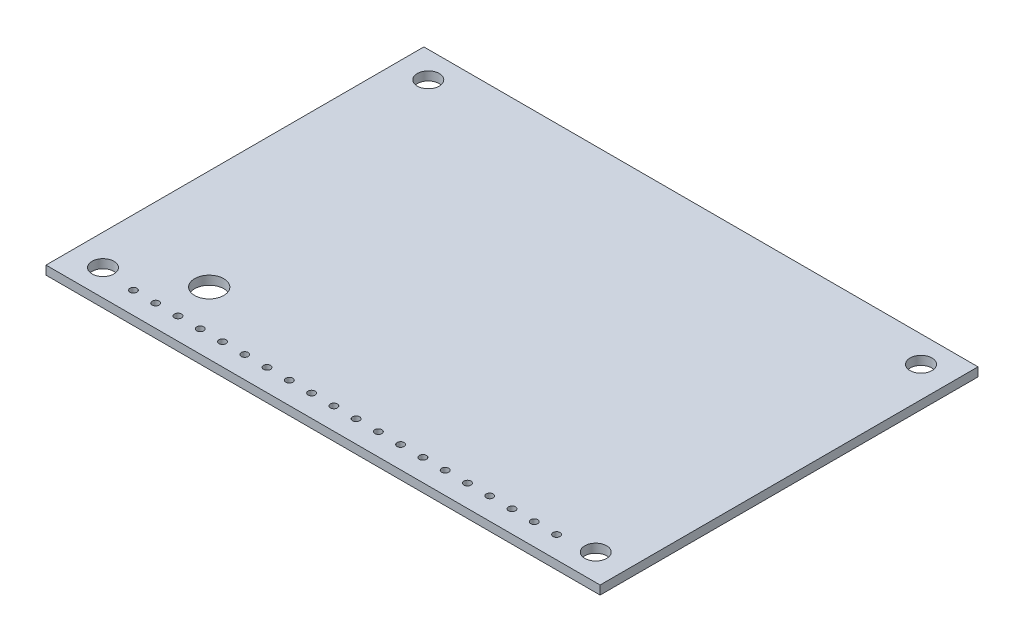
ISO-10303-21;
HEADER;
FILE_DESCRIPTION(('STEP AP214'),'2;1');
FILE_NAME('part.step','',(''),(''),'','','');
FILE_SCHEMA(('AUTOMOTIVE_DESIGN { 1 0 10303 214 1 1 1 1 }'));
ENDSEC;
DATA;
#1=APPLICATION_CONTEXT('core data for automotive mechanical design processes');
#2=APPLICATION_PROTOCOL_DEFINITION('international standard','automotive_design',2000,#1);
#3=PRODUCT_CONTEXT('',#1,'mechanical');
#4=PRODUCT('Part','Part','',(#3));
#5=PRODUCT_RELATED_PRODUCT_CATEGORY('part','',(#4));
#6=PRODUCT_DEFINITION_FORMATION('','',#4);
#7=PRODUCT_DEFINITION_CONTEXT('part definition',#1,'design');
#8=PRODUCT_DEFINITION('design','',#6,#7);
#9=PRODUCT_DEFINITION_SHAPE('','',#8);
#10=(LENGTH_UNIT() NAMED_UNIT(*) SI_UNIT(.MILLI.,.METRE.));
#11=(NAMED_UNIT(*) PLANE_ANGLE_UNIT() SI_UNIT($,.RADIAN.));
#12=(NAMED_UNIT(*) SI_UNIT($,.STERADIAN.) SOLID_ANGLE_UNIT());
#13=UNCERTAINTY_MEASURE_WITH_UNIT(LENGTH_MEASURE(1.E-05),#10,'distance_accuracy_value','');
#14=(GEOMETRIC_REPRESENTATION_CONTEXT(3) GLOBAL_UNCERTAINTY_ASSIGNED_CONTEXT((#13)) GLOBAL_UNIT_ASSIGNED_CONTEXT((#10,
#11,#12)) REPRESENTATION_CONTEXT('',''));
#15=CARTESIAN_POINT('',(0.,0.,0.));
#16=DIRECTION('',(0.,0.,1.));
#17=DIRECTION('',(1.,0.,0.));
#18=AXIS2_PLACEMENT_3D('',#15,#16,#17);
#19=CARTESIAN_POINT('',(0.,1.,0.));
#20=DIRECTION('',(1.,0.,0.));
#21=DIRECTION('',(0.,0.,-1.));
#22=AXIS2_PLACEMENT_3D('',#19,#20,#21);
#23=PLANE('',#22);
#24=DIRECTION('',(0.,0.,1.));
#25=VECTOR('',#24,1.);
#26=CARTESIAN_POINT('',(0.,0.,0.));
#27=LINE('',#26,#25);
#28=CARTESIAN_POINT('',(0.,0.,-43.1));
#29=VERTEX_POINT('',#28);
#30=CARTESIAN_POINT('',(0.,0.,0.));
#31=VERTEX_POINT('',#30);
#32=EDGE_CURVE('E97',#29,#31,#27,.T.);
#33=ORIENTED_EDGE('',*,*,#32,.T.);
#34=DIRECTION('',(0.,-1.,0.));
#35=VECTOR('',#34,1.);
#36=CARTESIAN_POINT('',(0.,1.,0.));
#37=LINE('',#36,#35);
#38=CARTESIAN_POINT('',(0.,1.,0.));
#39=VERTEX_POINT('',#38);
#40=EDGE_CURVE('E11',#39,#31,#37,.T.);
#41=ORIENTED_EDGE('',*,*,#40,.F.);
#42=DIRECTION('',(0.,0.,1.));
#43=VECTOR('',#42,1.);
#44=CARTESIAN_POINT('',(0.,1.,0.));
#45=LINE('',#44,#43);
#46=CARTESIAN_POINT('',(0.,1.,-43.1));
#47=VERTEX_POINT('',#46);
#48=EDGE_CURVE('E85',#47,#39,#45,.T.);
#49=ORIENTED_EDGE('',*,*,#48,.F.);
#50=DIRECTION('',(0.,-1.,0.));
#51=VECTOR('',#50,1.);
#52=CARTESIAN_POINT('',(0.,1.,-43.1));
#53=LINE('',#52,#51);
#54=EDGE_CURVE('E93',#47,#29,#53,.T.);
#55=ORIENTED_EDGE('',*,*,#54,.T.);
#56=EDGE_LOOP('',(#33,#41,#49,#55));
#57=FACE_BOUND('',#56,.T.);
#58=ADVANCED_FACE('F34',(#57),#23,.F.);
#59=CARTESIAN_POINT('',(0.,1.,0.));
#60=DIRECTION('',(0.,0.,-1.));
#61=DIRECTION('',(-1.,0.,0.));
#62=AXIS2_PLACEMENT_3D('',#59,#60,#61);
#63=PLANE('',#62);
#64=DIRECTION('',(1.,0.,0.));
#65=VECTOR('',#64,1.);
#66=CARTESIAN_POINT('',(0.,0.,0.));
#67=LINE('',#66,#65);
#68=CARTESIAN_POINT('',(63.2,0.,0.));
#69=VERTEX_POINT('',#68);
#70=EDGE_CURVE('E89',#31,#69,#67,.T.);
#71=ORIENTED_EDGE('',*,*,#70,.T.);
#72=DIRECTION('',(0.,-1.,0.));
#73=VECTOR('',#72,1.);
#74=CARTESIAN_POINT('',(63.2,1.,0.));
#75=LINE('',#74,#73);
#76=CARTESIAN_POINT('',(63.2,1.,0.));
#77=VERTEX_POINT('',#76);
#78=EDGE_CURVE('E42',#77,#69,#75,.T.);
#79=ORIENTED_EDGE('',*,*,#78,.F.);
#80=DIRECTION('',(1.,0.,0.));
#81=VECTOR('',#80,1.);
#82=CARTESIAN_POINT('',(0.,1.,0.));
#83=LINE('',#82,#81);
#84=EDGE_CURVE('E80',#39,#77,#83,.T.);
#85=ORIENTED_EDGE('',*,*,#84,.F.);
#86=ORIENTED_EDGE('',*,*,#40,.T.);
#87=EDGE_LOOP('',(#71,#79,#85,#86));
#88=FACE_BOUND('',#87,.T.);
#89=ADVANCED_FACE('F88',(#88),#63,.F.);
#90=CARTESIAN_POINT('',(63.2,1.,0.));
#91=DIRECTION('',(-1.,0.,0.));
#92=DIRECTION('',(0.,0.,1.));
#93=AXIS2_PLACEMENT_3D('',#90,#91,#92);
#94=PLANE('',#93);
#95=DIRECTION('',(0.,0.,-1.));
#96=VECTOR('',#95,1.);
#97=CARTESIAN_POINT('',(63.2,0.,0.));
#98=LINE('',#97,#96);
#99=CARTESIAN_POINT('',(63.2,0.,-43.1));
#100=VERTEX_POINT('',#99);
#101=EDGE_CURVE('E67',#69,#100,#98,.T.);
#102=ORIENTED_EDGE('',*,*,#101,.T.);
#103=DIRECTION('',(0.,-1.,0.));
#104=VECTOR('',#103,1.);
#105=CARTESIAN_POINT('',(63.2,1.,-43.1));
#106=LINE('',#105,#104);
#107=CARTESIAN_POINT('',(63.2,1.,-43.1));
#108=VERTEX_POINT('',#107);
#109=EDGE_CURVE('E90',#108,#100,#106,.T.);
#110=ORIENTED_EDGE('',*,*,#109,.F.);
#111=DIRECTION('',(0.,0.,-1.));
#112=VECTOR('',#111,1.);
#113=CARTESIAN_POINT('',(63.2,1.,0.));
#114=LINE('',#113,#112);
#115=EDGE_CURVE('E83',#77,#108,#114,.T.);
#116=ORIENTED_EDGE('',*,*,#115,.F.);
#117=ORIENTED_EDGE('',*,*,#78,.T.);
#118=EDGE_LOOP('',(#102,#110,#116,#117));
#119=FACE_BOUND('',#118,.T.);
#120=ADVANCED_FACE('F91',(#119),#94,.F.);
#121=CARTESIAN_POINT('',(0.,1.,-43.1));
#122=DIRECTION('',(0.,0.,1.));
#123=DIRECTION('',(1.,0.,0.));
#124=AXIS2_PLACEMENT_3D('',#121,#122,#123);
#125=PLANE('',#124);
#126=DIRECTION('',(-1.,0.,0.));
#127=VECTOR('',#126,1.);
#128=CARTESIAN_POINT('',(0.,0.,-43.1));
#129=LINE('',#128,#127);
#130=EDGE_CURVE('E73',#100,#29,#129,.T.);
#131=ORIENTED_EDGE('',*,*,#130,.T.);
#132=ORIENTED_EDGE('',*,*,#54,.F.);
#133=DIRECTION('',(-1.,0.,0.));
#134=VECTOR('',#133,1.);
#135=CARTESIAN_POINT('',(0.,1.,-43.1));
#136=LINE('',#135,#134);
#137=EDGE_CURVE('E50',#108,#47,#136,.T.);
#138=ORIENTED_EDGE('',*,*,#137,.F.);
#139=ORIENTED_EDGE('',*,*,#109,.T.);
#140=EDGE_LOOP('',(#131,#132,#138,#139));
#141=FACE_BOUND('',#140,.T.);
#142=ADVANCED_FACE('F105',(#141),#125,.F.);
#143=CARTESIAN_POINT('',(0.,1.,0.));
#144=DIRECTION('',(0.,-1.,0.));
#145=DIRECTION('',(0.,0.,-1.));
#146=AXIS2_PLACEMENT_3D('',#143,#144,#145);
#147=PLANE('',#146);
#148=CARTESIAN_POINT('',(11.4785363190109,1.,-7.13614600509405));
#149=DIRECTION('',(0.,-1.,0.));
#150=DIRECTION('',(0.,0.,-1.));
#151=AXIS2_PLACEMENT_3D('',#148,#149,#150);
#152=CIRCLE('',#151,1.6633681039103);
#153=CARTESIAN_POINT('',(11.4785363190109,1.,-8.79951410900434));
#154=VERTEX_POINT('',#153);
#155=EDGE_CURVE('E252',#154,#154,#152,.F.);
#156=ORIENTED_EDGE('',*,*,#155,.F.);
#157=EDGE_LOOP('',(#156));
#158=FACE_BOUND('',#157,.T.);
#159=CARTESIAN_POINT('',(55.73,1.,-2.5));
#160=DIRECTION('',(0.,1.,0.));
#161=DIRECTION('',(0.,0.,1.));
#162=AXIS2_PLACEMENT_3D('',#159,#160,#161);
#163=CIRCLE('',#162,0.400000000000005);
#164=CARTESIAN_POINT('',(55.73,1.,-2.1));
#165=VERTEX_POINT('',#164);
#166=EDGE_CURVE('E246',#165,#165,#163,.T.);
#167=ORIENTED_EDGE('',*,*,#166,.F.);
#168=EDGE_LOOP('',(#167));
#169=FACE_BOUND('',#168,.T.);
#170=CARTESIAN_POINT('',(53.19,1.,-2.5));
#171=DIRECTION('',(0.,1.,0.));
#172=DIRECTION('',(0.,0.,1.));
#173=AXIS2_PLACEMENT_3D('',#170,#171,#172);
#174=CIRCLE('',#173,0.400000000000005);
#175=CARTESIAN_POINT('',(53.19,1.,-2.1));
#176=VERTEX_POINT('',#175);
#177=EDGE_CURVE('E240',#176,#176,#174,.T.);
#178=ORIENTED_EDGE('',*,*,#177,.F.);
#179=EDGE_LOOP('',(#178));
#180=FACE_BOUND('',#179,.T.);
#181=CARTESIAN_POINT('',(50.65,1.,-2.5));
#182=DIRECTION('',(0.,1.,0.));
#183=DIRECTION('',(0.,0.,1.));
#184=AXIS2_PLACEMENT_3D('',#181,#182,#183);
#185=CIRCLE('',#184,0.400000000000005);
#186=CARTESIAN_POINT('',(50.65,1.,-2.1));
#187=VERTEX_POINT('',#186);
#188=EDGE_CURVE('E234',#187,#187,#185,.T.);
#189=ORIENTED_EDGE('',*,*,#188,.F.);
#190=EDGE_LOOP('',(#189));
#191=FACE_BOUND('',#190,.T.);
#192=CARTESIAN_POINT('',(48.11,1.,-2.5));
#193=DIRECTION('',(0.,1.,0.));
#194=DIRECTION('',(0.,0.,1.));
#195=AXIS2_PLACEMENT_3D('',#192,#193,#194);
#196=CIRCLE('',#195,0.400000000000005);
#197=CARTESIAN_POINT('',(48.11,1.,-2.1));
#198=VERTEX_POINT('',#197);
#199=EDGE_CURVE('E228',#198,#198,#196,.T.);
#200=ORIENTED_EDGE('',*,*,#199,.F.);
#201=EDGE_LOOP('',(#200));
#202=FACE_BOUND('',#201,.T.);
#203=CARTESIAN_POINT('',(45.57,1.,-2.5));
#204=DIRECTION('',(0.,1.,0.));
#205=DIRECTION('',(0.,0.,1.));
#206=AXIS2_PLACEMENT_3D('',#203,#204,#205);
#207=CIRCLE('',#206,0.400000000000005);
#208=CARTESIAN_POINT('',(45.57,1.,-2.1));
#209=VERTEX_POINT('',#208);
#210=EDGE_CURVE('E222',#209,#209,#207,.T.);
#211=ORIENTED_EDGE('',*,*,#210,.F.);
#212=EDGE_LOOP('',(#211));
#213=FACE_BOUND('',#212,.T.);
#214=CARTESIAN_POINT('',(43.03,1.,-2.5));
#215=DIRECTION('',(0.,1.,0.));
#216=DIRECTION('',(0.,0.,1.));
#217=AXIS2_PLACEMENT_3D('',#214,#215,#216);
#218=CIRCLE('',#217,0.400000000000005);
#219=CARTESIAN_POINT('',(43.03,1.,-2.1));
#220=VERTEX_POINT('',#219);
#221=EDGE_CURVE('E216',#220,#220,#218,.T.);
#222=ORIENTED_EDGE('',*,*,#221,.F.);
#223=EDGE_LOOP('',(#222));
#224=FACE_BOUND('',#223,.T.);
#225=CARTESIAN_POINT('',(40.49,1.,-2.5));
#226=DIRECTION('',(0.,1.,0.));
#227=DIRECTION('',(0.,0.,1.));
#228=AXIS2_PLACEMENT_3D('',#225,#226,#227);
#229=CIRCLE('',#228,0.400000000000005);
#230=CARTESIAN_POINT('',(40.49,1.,-2.1));
#231=VERTEX_POINT('',#230);
#232=EDGE_CURVE('E210',#231,#231,#229,.T.);
#233=ORIENTED_EDGE('',*,*,#232,.F.);
#234=EDGE_LOOP('',(#233));
#235=FACE_BOUND('',#234,.T.);
#236=CARTESIAN_POINT('',(37.95,1.,-2.5));
#237=DIRECTION('',(0.,1.,0.));
#238=DIRECTION('',(0.,0.,1.));
#239=AXIS2_PLACEMENT_3D('',#236,#237,#238);
#240=CIRCLE('',#239,0.400000000000005);
#241=CARTESIAN_POINT('',(37.95,1.,-2.1));
#242=VERTEX_POINT('',#241);
#243=EDGE_CURVE('E204',#242,#242,#240,.T.);
#244=ORIENTED_EDGE('',*,*,#243,.F.);
#245=EDGE_LOOP('',(#244));
#246=FACE_BOUND('',#245,.T.);
#247=CARTESIAN_POINT('',(35.41,1.,-2.5));
#248=DIRECTION('',(0.,1.,0.));
#249=DIRECTION('',(0.,0.,1.));
#250=AXIS2_PLACEMENT_3D('',#247,#248,#249);
#251=CIRCLE('',#250,0.399999999999998);
#252=CARTESIAN_POINT('',(35.41,1.,-2.1));
#253=VERTEX_POINT('',#252);
#254=EDGE_CURVE('E198',#253,#253,#251,.T.);
#255=ORIENTED_EDGE('',*,*,#254,.F.);
#256=EDGE_LOOP('',(#255));
#257=FACE_BOUND('',#256,.T.);
#258=CARTESIAN_POINT('',(32.87,1.,-2.5));
#259=DIRECTION('',(0.,1.,0.));
#260=DIRECTION('',(0.,0.,1.));
#261=AXIS2_PLACEMENT_3D('',#258,#259,#260);
#262=CIRCLE('',#261,0.399999999999998);
#263=CARTESIAN_POINT('',(32.87,1.,-2.1));
#264=VERTEX_POINT('',#263);
#265=EDGE_CURVE('E192',#264,#264,#262,.T.);
#266=ORIENTED_EDGE('',*,*,#265,.F.);
#267=EDGE_LOOP('',(#266));
#268=FACE_BOUND('',#267,.T.);
#269=CARTESIAN_POINT('',(30.33,1.,-2.5));
#270=DIRECTION('',(0.,1.,0.));
#271=DIRECTION('',(0.,0.,1.));
#272=AXIS2_PLACEMENT_3D('',#269,#270,#271);
#273=CIRCLE('',#272,0.399999999999998);
#274=CARTESIAN_POINT('',(30.33,1.,-2.1));
#275=VERTEX_POINT('',#274);
#276=EDGE_CURVE('E186',#275,#275,#273,.T.);
#277=ORIENTED_EDGE('',*,*,#276,.F.);
#278=EDGE_LOOP('',(#277));
#279=FACE_BOUND('',#278,.T.);
#280=CARTESIAN_POINT('',(27.79,1.,-2.5));
#281=DIRECTION('',(0.,1.,0.));
#282=DIRECTION('',(0.,0.,1.));
#283=AXIS2_PLACEMENT_3D('',#280,#281,#282);
#284=CIRCLE('',#283,0.399999999999998);
#285=CARTESIAN_POINT('',(27.79,1.,-2.1));
#286=VERTEX_POINT('',#285);
#287=EDGE_CURVE('E180',#286,#286,#284,.T.);
#288=ORIENTED_EDGE('',*,*,#287,.F.);
#289=EDGE_LOOP('',(#288));
#290=FACE_BOUND('',#289,.T.);
#291=CARTESIAN_POINT('',(25.25,1.,-2.5));
#292=DIRECTION('',(0.,1.,0.));
#293=DIRECTION('',(0.,0.,1.));
#294=AXIS2_PLACEMENT_3D('',#291,#292,#293);
#295=CIRCLE('',#294,0.399999999999998);
#296=CARTESIAN_POINT('',(25.25,1.,-2.1));
#297=VERTEX_POINT('',#296);
#298=EDGE_CURVE('E174',#297,#297,#295,.T.);
#299=ORIENTED_EDGE('',*,*,#298,.F.);
#300=EDGE_LOOP('',(#299));
#301=FACE_BOUND('',#300,.T.);
#302=CARTESIAN_POINT('',(22.71,1.,-2.5));
#303=DIRECTION('',(0.,1.,0.));
#304=DIRECTION('',(0.,0.,1.));
#305=AXIS2_PLACEMENT_3D('',#302,#303,#304);
#306=CIRCLE('',#305,0.399999999999998);
#307=CARTESIAN_POINT('',(22.71,1.,-2.1));
#308=VERTEX_POINT('',#307);
#309=EDGE_CURVE('E168',#308,#308,#306,.T.);
#310=ORIENTED_EDGE('',*,*,#309,.F.);
#311=EDGE_LOOP('',(#310));
#312=FACE_BOUND('',#311,.T.);
#313=CARTESIAN_POINT('',(20.17,1.,-2.5));
#314=DIRECTION('',(0.,1.,0.));
#315=DIRECTION('',(0.,0.,1.));
#316=AXIS2_PLACEMENT_3D('',#313,#314,#315);
#317=CIRCLE('',#316,0.400000000000001);
#318=CARTESIAN_POINT('',(20.17,1.,-2.1));
#319=VERTEX_POINT('',#318);
#320=EDGE_CURVE('E162',#319,#319,#317,.T.);
#321=ORIENTED_EDGE('',*,*,#320,.F.);
#322=EDGE_LOOP('',(#321));
#323=FACE_BOUND('',#322,.T.);
#324=CARTESIAN_POINT('',(17.63,1.,-2.5));
#325=DIRECTION('',(0.,1.,0.));
#326=DIRECTION('',(0.,0.,1.));
#327=AXIS2_PLACEMENT_3D('',#324,#325,#326);
#328=CIRCLE('',#327,0.400000000000001);
#329=CARTESIAN_POINT('',(17.63,1.,-2.1));
#330=VERTEX_POINT('',#329);
#331=EDGE_CURVE('E156',#330,#330,#328,.T.);
#332=ORIENTED_EDGE('',*,*,#331,.F.);
#333=EDGE_LOOP('',(#332));
#334=FACE_BOUND('',#333,.T.);
#335=CARTESIAN_POINT('',(15.09,1.,-2.5));
#336=DIRECTION('',(0.,1.,0.));
#337=DIRECTION('',(0.,0.,1.));
#338=AXIS2_PLACEMENT_3D('',#335,#336,#337);
#339=CIRCLE('',#338,0.400000000000001);
#340=CARTESIAN_POINT('',(15.09,1.,-2.1));
#341=VERTEX_POINT('',#340);
#342=EDGE_CURVE('E150',#341,#341,#339,.T.);
#343=ORIENTED_EDGE('',*,*,#342,.F.);
#344=EDGE_LOOP('',(#343));
#345=FACE_BOUND('',#344,.T.);
#346=CARTESIAN_POINT('',(12.55,1.,-2.5));
#347=DIRECTION('',(0.,1.,0.));
#348=DIRECTION('',(0.,0.,1.));
#349=AXIS2_PLACEMENT_3D('',#346,#347,#348);
#350=CIRCLE('',#349,0.4);
#351=CARTESIAN_POINT('',(12.55,1.,-2.1));
#352=VERTEX_POINT('',#351);
#353=EDGE_CURVE('E144',#352,#352,#350,.T.);
#354=ORIENTED_EDGE('',*,*,#353,.F.);
#355=EDGE_LOOP('',(#354));
#356=FACE_BOUND('',#355,.T.);
#357=CARTESIAN_POINT('',(10.01,1.,-2.5));
#358=DIRECTION('',(0.,1.,0.));
#359=DIRECTION('',(0.,0.,1.));
#360=AXIS2_PLACEMENT_3D('',#357,#358,#359);
#361=CIRCLE('',#360,0.400000000000001);
#362=CARTESIAN_POINT('',(10.01,1.,-2.1));
#363=VERTEX_POINT('',#362);
#364=EDGE_CURVE('E138',#363,#363,#361,.T.);
#365=ORIENTED_EDGE('',*,*,#364,.F.);
#366=EDGE_LOOP('',(#365));
#367=FACE_BOUND('',#366,.T.);
#368=CARTESIAN_POINT('',(7.46999999999997,1.,-2.5));
#369=DIRECTION('',(0.,1.,0.));
#370=DIRECTION('',(0.,0.,1.));
#371=AXIS2_PLACEMENT_3D('',#368,#369,#370);
#372=CIRCLE('',#371,0.4);
#373=CARTESIAN_POINT('',(7.46999999999997,1.,-2.1));
#374=VERTEX_POINT('',#373);
#375=EDGE_CURVE('E132',#374,#374,#372,.T.);
#376=ORIENTED_EDGE('',*,*,#375,.F.);
#377=EDGE_LOOP('',(#376));
#378=FACE_BOUND('',#377,.T.);
#379=CARTESIAN_POINT('',(3.49999999999997,1.,-3.));
#380=DIRECTION('',(0.,1.,0.));
#381=DIRECTION('',(0.,0.,1.));
#382=AXIS2_PLACEMENT_3D('',#379,#380,#381);
#383=CIRCLE('',#382,1.25);
#384=CARTESIAN_POINT('',(3.49999999999997,1.,-1.75));
#385=VERTEX_POINT('',#384);
#386=EDGE_CURVE('E126',#385,#385,#383,.T.);
#387=ORIENTED_EDGE('',*,*,#386,.F.);
#388=EDGE_LOOP('',(#387));
#389=FACE_BOUND('',#388,.T.);
#390=CARTESIAN_POINT('',(59.7,1.,-3.));
#391=DIRECTION('',(0.,1.,0.));
#392=DIRECTION('',(0.,0.,1.));
#393=AXIS2_PLACEMENT_3D('',#390,#391,#392);
#394=CIRCLE('',#393,1.25);
#395=CARTESIAN_POINT('',(59.7,1.,-1.75));
#396=VERTEX_POINT('',#395);
#397=EDGE_CURVE('E120',#396,#396,#394,.T.);
#398=ORIENTED_EDGE('',*,*,#397,.F.);
#399=EDGE_LOOP('',(#398));
#400=FACE_BOUND('',#399,.T.);
#401=CARTESIAN_POINT('',(59.7,1.,-40.1));
#402=DIRECTION('',(0.,1.,0.));
#403=DIRECTION('',(0.,0.,1.));
#404=AXIS2_PLACEMENT_3D('',#401,#402,#403);
#405=CIRCLE('',#404,1.25);
#406=CARTESIAN_POINT('',(59.7,1.,-38.85));
#407=VERTEX_POINT('',#406);
#408=EDGE_CURVE('E114',#407,#407,#405,.T.);
#409=ORIENTED_EDGE('',*,*,#408,.F.);
#410=EDGE_LOOP('',(#409));
#411=FACE_BOUND('',#410,.T.);
#412=CARTESIAN_POINT('',(3.49999999999997,1.,-40.1));
#413=DIRECTION('',(0.,1.,0.));
#414=DIRECTION('',(0.,0.,1.));
#415=AXIS2_PLACEMENT_3D('',#412,#413,#414);
#416=CIRCLE('',#415,1.25);
#417=CARTESIAN_POINT('',(3.49999999999997,1.,-38.85));
#418=VERTEX_POINT('',#417);
#419=EDGE_CURVE('E100',#418,#418,#416,.T.);
#420=ORIENTED_EDGE('',*,*,#419,.F.);
#421=EDGE_LOOP('',(#420));
#422=FACE_BOUND('',#421,.T.);
#423=ORIENTED_EDGE('',*,*,#48,.T.);
#424=ORIENTED_EDGE('',*,*,#84,.T.);
#425=ORIENTED_EDGE('',*,*,#115,.T.);
#426=ORIENTED_EDGE('',*,*,#137,.T.);
#427=EDGE_LOOP('',(#423,#424,#425,#426));
#428=FACE_BOUND('',#427,.T.);
#429=ADVANCED_FACE('F81',(#158,#169,#180,#191,#202,#213,#224,#235,#246,#257,#268,#279,#290,#301,
#312,#323,#334,#345,#356,#367,#378,#389,#400,#411,#422,#428),#147,.F.);
#430=CARTESIAN_POINT('',(0.,0.,0.));
#431=DIRECTION('',(0.,-1.,0.));
#432=DIRECTION('',(0.,0.,-1.));
#433=AXIS2_PLACEMENT_3D('',#430,#431,#432);
#434=PLANE('',#433);
#435=CARTESIAN_POINT('',(11.4785363190109,0.,-7.13614600509405));
#436=DIRECTION('',(0.,-1.,0.));
#437=DIRECTION('',(0.,0.,-1.));
#438=AXIS2_PLACEMENT_3D('',#435,#436,#437);
#439=CIRCLE('',#438,1.6633681039103);
#440=CARTESIAN_POINT('',(11.4785363190109,0.,-8.79951410900434));
#441=VERTEX_POINT('',#440);
#442=EDGE_CURVE('E257',#441,#441,#439,.T.);
#443=ORIENTED_EDGE('',*,*,#442,.F.);
#444=EDGE_LOOP('',(#443));
#445=FACE_BOUND('',#444,.T.);
#446=CARTESIAN_POINT('',(55.73,0.,-2.5));
#447=DIRECTION('',(0.,-1.,0.));
#448=DIRECTION('',(0.,0.,-1.));
#449=AXIS2_PLACEMENT_3D('',#446,#447,#448);
#450=CIRCLE('',#449,0.400000000000005);
#451=CARTESIAN_POINT('',(55.73,0.,-2.90000000000001));
#452=VERTEX_POINT('',#451);
#453=EDGE_CURVE('E249',#452,#452,#450,.F.);
#454=ORIENTED_EDGE('',*,*,#453,.T.);
#455=EDGE_LOOP('',(#454));
#456=FACE_BOUND('',#455,.T.);
#457=CARTESIAN_POINT('',(53.19,0.,-2.5));
#458=DIRECTION('',(0.,-1.,0.));
#459=DIRECTION('',(0.,0.,-1.));
#460=AXIS2_PLACEMENT_3D('',#457,#458,#459);
#461=CIRCLE('',#460,0.400000000000005);
#462=CARTESIAN_POINT('',(53.19,0.,-2.90000000000001));
#463=VERTEX_POINT('',#462);
#464=EDGE_CURVE('E243',#463,#463,#461,.F.);
#465=ORIENTED_EDGE('',*,*,#464,.T.);
#466=EDGE_LOOP('',(#465));
#467=FACE_BOUND('',#466,.T.);
#468=CARTESIAN_POINT('',(50.65,0.,-2.5));
#469=DIRECTION('',(0.,-1.,0.));
#470=DIRECTION('',(0.,0.,-1.));
#471=AXIS2_PLACEMENT_3D('',#468,#469,#470);
#472=CIRCLE('',#471,0.400000000000005);
#473=CARTESIAN_POINT('',(50.65,0.,-2.90000000000001));
#474=VERTEX_POINT('',#473);
#475=EDGE_CURVE('E237',#474,#474,#472,.F.);
#476=ORIENTED_EDGE('',*,*,#475,.T.);
#477=EDGE_LOOP('',(#476));
#478=FACE_BOUND('',#477,.T.);
#479=CARTESIAN_POINT('',(48.11,0.,-2.5));
#480=DIRECTION('',(0.,-1.,0.));
#481=DIRECTION('',(0.,0.,-1.));
#482=AXIS2_PLACEMENT_3D('',#479,#480,#481);
#483=CIRCLE('',#482,0.400000000000005);
#484=CARTESIAN_POINT('',(48.11,0.,-2.90000000000001));
#485=VERTEX_POINT('',#484);
#486=EDGE_CURVE('E231',#485,#485,#483,.F.);
#487=ORIENTED_EDGE('',*,*,#486,.T.);
#488=EDGE_LOOP('',(#487));
#489=FACE_BOUND('',#488,.T.);
#490=CARTESIAN_POINT('',(45.57,0.,-2.5));
#491=DIRECTION('',(0.,-1.,0.));
#492=DIRECTION('',(0.,0.,-1.));
#493=AXIS2_PLACEMENT_3D('',#490,#491,#492);
#494=CIRCLE('',#493,0.400000000000005);
#495=CARTESIAN_POINT('',(45.57,0.,-2.90000000000001));
#496=VERTEX_POINT('',#495);
#497=EDGE_CURVE('E225',#496,#496,#494,.F.);
#498=ORIENTED_EDGE('',*,*,#497,.T.);
#499=EDGE_LOOP('',(#498));
#500=FACE_BOUND('',#499,.T.);
#501=CARTESIAN_POINT('',(43.03,0.,-2.5));
#502=DIRECTION('',(0.,-1.,0.));
#503=DIRECTION('',(0.,0.,-1.));
#504=AXIS2_PLACEMENT_3D('',#501,#502,#503);
#505=CIRCLE('',#504,0.400000000000005);
#506=CARTESIAN_POINT('',(43.03,0.,-2.90000000000001));
#507=VERTEX_POINT('',#506);
#508=EDGE_CURVE('E219',#507,#507,#505,.F.);
#509=ORIENTED_EDGE('',*,*,#508,.T.);
#510=EDGE_LOOP('',(#509));
#511=FACE_BOUND('',#510,.T.);
#512=CARTESIAN_POINT('',(40.49,0.,-2.5));
#513=DIRECTION('',(0.,-1.,0.));
#514=DIRECTION('',(0.,0.,-1.));
#515=AXIS2_PLACEMENT_3D('',#512,#513,#514);
#516=CIRCLE('',#515,0.400000000000005);
#517=CARTESIAN_POINT('',(40.49,0.,-2.90000000000001));
#518=VERTEX_POINT('',#517);
#519=EDGE_CURVE('E213',#518,#518,#516,.F.);
#520=ORIENTED_EDGE('',*,*,#519,.T.);
#521=EDGE_LOOP('',(#520));
#522=FACE_BOUND('',#521,.T.);
#523=CARTESIAN_POINT('',(37.95,0.,-2.5));
#524=DIRECTION('',(0.,-1.,0.));
#525=DIRECTION('',(0.,0.,-1.));
#526=AXIS2_PLACEMENT_3D('',#523,#524,#525);
#527=CIRCLE('',#526,0.400000000000005);
#528=CARTESIAN_POINT('',(37.95,0.,-2.90000000000001));
#529=VERTEX_POINT('',#528);
#530=EDGE_CURVE('E207',#529,#529,#527,.F.);
#531=ORIENTED_EDGE('',*,*,#530,.T.);
#532=EDGE_LOOP('',(#531));
#533=FACE_BOUND('',#532,.T.);
#534=CARTESIAN_POINT('',(35.41,0.,-2.5));
#535=DIRECTION('',(0.,-1.,0.));
#536=DIRECTION('',(0.,0.,-1.));
#537=AXIS2_PLACEMENT_3D('',#534,#535,#536);
#538=CIRCLE('',#537,0.399999999999998);
#539=CARTESIAN_POINT('',(35.41,0.,-2.9));
#540=VERTEX_POINT('',#539);
#541=EDGE_CURVE('E201',#540,#540,#538,.F.);
#542=ORIENTED_EDGE('',*,*,#541,.T.);
#543=EDGE_LOOP('',(#542));
#544=FACE_BOUND('',#543,.T.);
#545=CARTESIAN_POINT('',(32.87,0.,-2.5));
#546=DIRECTION('',(0.,-1.,0.));
#547=DIRECTION('',(0.,0.,-1.));
#548=AXIS2_PLACEMENT_3D('',#545,#546,#547);
#549=CIRCLE('',#548,0.399999999999998);
#550=CARTESIAN_POINT('',(32.87,0.,-2.9));
#551=VERTEX_POINT('',#550);
#552=EDGE_CURVE('E195',#551,#551,#549,.F.);
#553=ORIENTED_EDGE('',*,*,#552,.T.);
#554=EDGE_LOOP('',(#553));
#555=FACE_BOUND('',#554,.T.);
#556=CARTESIAN_POINT('',(30.33,0.,-2.5));
#557=DIRECTION('',(0.,-1.,0.));
#558=DIRECTION('',(0.,0.,-1.));
#559=AXIS2_PLACEMENT_3D('',#556,#557,#558);
#560=CIRCLE('',#559,0.399999999999998);
#561=CARTESIAN_POINT('',(30.33,0.,-2.9));
#562=VERTEX_POINT('',#561);
#563=EDGE_CURVE('E189',#562,#562,#560,.F.);
#564=ORIENTED_EDGE('',*,*,#563,.T.);
#565=EDGE_LOOP('',(#564));
#566=FACE_BOUND('',#565,.T.);
#567=CARTESIAN_POINT('',(27.79,0.,-2.5));
#568=DIRECTION('',(0.,-1.,0.));
#569=DIRECTION('',(0.,0.,-1.));
#570=AXIS2_PLACEMENT_3D('',#567,#568,#569);
#571=CIRCLE('',#570,0.399999999999998);
#572=CARTESIAN_POINT('',(27.79,0.,-2.9));
#573=VERTEX_POINT('',#572);
#574=EDGE_CURVE('E183',#573,#573,#571,.F.);
#575=ORIENTED_EDGE('',*,*,#574,.T.);
#576=EDGE_LOOP('',(#575));
#577=FACE_BOUND('',#576,.T.);
#578=CARTESIAN_POINT('',(25.25,0.,-2.5));
#579=DIRECTION('',(0.,-1.,0.));
#580=DIRECTION('',(0.,0.,-1.));
#581=AXIS2_PLACEMENT_3D('',#578,#579,#580);
#582=CIRCLE('',#581,0.399999999999998);
#583=CARTESIAN_POINT('',(25.25,0.,-2.9));
#584=VERTEX_POINT('',#583);
#585=EDGE_CURVE('E177',#584,#584,#582,.F.);
#586=ORIENTED_EDGE('',*,*,#585,.T.);
#587=EDGE_LOOP('',(#586));
#588=FACE_BOUND('',#587,.T.);
#589=CARTESIAN_POINT('',(22.71,0.,-2.5));
#590=DIRECTION('',(0.,-1.,0.));
#591=DIRECTION('',(0.,0.,-1.));
#592=AXIS2_PLACEMENT_3D('',#589,#590,#591);
#593=CIRCLE('',#592,0.399999999999998);
#594=CARTESIAN_POINT('',(22.71,0.,-2.9));
#595=VERTEX_POINT('',#594);
#596=EDGE_CURVE('E171',#595,#595,#593,.F.);
#597=ORIENTED_EDGE('',*,*,#596,.T.);
#598=EDGE_LOOP('',(#597));
#599=FACE_BOUND('',#598,.T.);
#600=CARTESIAN_POINT('',(20.17,0.,-2.5));
#601=DIRECTION('',(0.,-1.,0.));
#602=DIRECTION('',(0.,0.,-1.));
#603=AXIS2_PLACEMENT_3D('',#600,#601,#602);
#604=CIRCLE('',#603,0.400000000000001);
#605=CARTESIAN_POINT('',(20.17,0.,-2.9));
#606=VERTEX_POINT('',#605);
#607=EDGE_CURVE('E165',#606,#606,#604,.F.);
#608=ORIENTED_EDGE('',*,*,#607,.T.);
#609=EDGE_LOOP('',(#608));
#610=FACE_BOUND('',#609,.T.);
#611=CARTESIAN_POINT('',(17.63,0.,-2.5));
#612=DIRECTION('',(0.,-1.,0.));
#613=DIRECTION('',(0.,0.,-1.));
#614=AXIS2_PLACEMENT_3D('',#611,#612,#613);
#615=CIRCLE('',#614,0.400000000000001);
#616=CARTESIAN_POINT('',(17.63,0.,-2.9));
#617=VERTEX_POINT('',#616);
#618=EDGE_CURVE('E159',#617,#617,#615,.F.);
#619=ORIENTED_EDGE('',*,*,#618,.T.);
#620=EDGE_LOOP('',(#619));
#621=FACE_BOUND('',#620,.T.);
#622=CARTESIAN_POINT('',(15.09,0.,-2.5));
#623=DIRECTION('',(0.,-1.,0.));
#624=DIRECTION('',(0.,0.,-1.));
#625=AXIS2_PLACEMENT_3D('',#622,#623,#624);
#626=CIRCLE('',#625,0.400000000000001);
#627=CARTESIAN_POINT('',(15.09,0.,-2.9));
#628=VERTEX_POINT('',#627);
#629=EDGE_CURVE('E153',#628,#628,#626,.F.);
#630=ORIENTED_EDGE('',*,*,#629,.T.);
#631=EDGE_LOOP('',(#630));
#632=FACE_BOUND('',#631,.T.);
#633=CARTESIAN_POINT('',(12.55,0.,-2.5));
#634=DIRECTION('',(0.,-1.,0.));
#635=DIRECTION('',(0.,0.,-1.));
#636=AXIS2_PLACEMENT_3D('',#633,#634,#635);
#637=CIRCLE('',#636,0.4);
#638=CARTESIAN_POINT('',(12.55,0.,-2.9));
#639=VERTEX_POINT('',#638);
#640=EDGE_CURVE('E147',#639,#639,#637,.F.);
#641=ORIENTED_EDGE('',*,*,#640,.T.);
#642=EDGE_LOOP('',(#641));
#643=FACE_BOUND('',#642,.T.);
#644=CARTESIAN_POINT('',(10.01,0.,-2.5));
#645=DIRECTION('',(0.,-1.,0.));
#646=DIRECTION('',(0.,0.,-1.));
#647=AXIS2_PLACEMENT_3D('',#644,#645,#646);
#648=CIRCLE('',#647,0.400000000000001);
#649=CARTESIAN_POINT('',(10.01,0.,-2.9));
#650=VERTEX_POINT('',#649);
#651=EDGE_CURVE('E141',#650,#650,#648,.F.);
#652=ORIENTED_EDGE('',*,*,#651,.T.);
#653=EDGE_LOOP('',(#652));
#654=FACE_BOUND('',#653,.T.);
#655=CARTESIAN_POINT('',(7.46999999999997,0.,-2.5));
#656=DIRECTION('',(0.,-1.,0.));
#657=DIRECTION('',(0.,0.,-1.));
#658=AXIS2_PLACEMENT_3D('',#655,#656,#657);
#659=CIRCLE('',#658,0.4);
#660=CARTESIAN_POINT('',(7.46999999999997,0.,-2.9));
#661=VERTEX_POINT('',#660);
#662=EDGE_CURVE('E135',#661,#661,#659,.F.);
#663=ORIENTED_EDGE('',*,*,#662,.T.);
#664=EDGE_LOOP('',(#663));
#665=FACE_BOUND('',#664,.T.);
#666=CARTESIAN_POINT('',(3.49999999999997,0.,-3.));
#667=DIRECTION('',(0.,-1.,0.));
#668=DIRECTION('',(0.,0.,-1.));
#669=AXIS2_PLACEMENT_3D('',#666,#667,#668);
#670=CIRCLE('',#669,1.25);
#671=CARTESIAN_POINT('',(3.49999999999997,0.,-4.25));
#672=VERTEX_POINT('',#671);
#673=EDGE_CURVE('E129',#672,#672,#670,.F.);
#674=ORIENTED_EDGE('',*,*,#673,.T.);
#675=EDGE_LOOP('',(#674));
#676=FACE_BOUND('',#675,.T.);
#677=CARTESIAN_POINT('',(59.7,0.,-3.));
#678=DIRECTION('',(0.,-1.,0.));
#679=DIRECTION('',(0.,0.,-1.));
#680=AXIS2_PLACEMENT_3D('',#677,#678,#679);
#681=CIRCLE('',#680,1.25);
#682=CARTESIAN_POINT('',(59.7,0.,-4.25));
#683=VERTEX_POINT('',#682);
#684=EDGE_CURVE('E123',#683,#683,#681,.F.);
#685=ORIENTED_EDGE('',*,*,#684,.T.);
#686=EDGE_LOOP('',(#685));
#687=FACE_BOUND('',#686,.T.);
#688=CARTESIAN_POINT('',(59.7,0.,-40.1));
#689=DIRECTION('',(0.,-1.,0.));
#690=DIRECTION('',(0.,0.,-1.));
#691=AXIS2_PLACEMENT_3D('',#688,#689,#690);
#692=CIRCLE('',#691,1.25);
#693=CARTESIAN_POINT('',(59.7,0.,-41.35));
#694=VERTEX_POINT('',#693);
#695=EDGE_CURVE('E117',#694,#694,#692,.F.);
#696=ORIENTED_EDGE('',*,*,#695,.T.);
#697=EDGE_LOOP('',(#696));
#698=FACE_BOUND('',#697,.T.);
#699=CARTESIAN_POINT('',(3.49999999999997,0.,-40.1));
#700=DIRECTION('',(0.,-1.,0.));
#701=DIRECTION('',(0.,0.,-1.));
#702=AXIS2_PLACEMENT_3D('',#699,#700,#701);
#703=CIRCLE('',#702,1.25);
#704=CARTESIAN_POINT('',(3.49999999999997,0.,-41.35));
#705=VERTEX_POINT('',#704);
#706=EDGE_CURVE('E111',#705,#705,#703,.F.);
#707=ORIENTED_EDGE('',*,*,#706,.T.);
#708=EDGE_LOOP('',(#707));
#709=FACE_BOUND('',#708,.T.);
#710=ORIENTED_EDGE('',*,*,#32,.F.);
#711=ORIENTED_EDGE('',*,*,#130,.F.);
#712=ORIENTED_EDGE('',*,*,#101,.F.);
#713=ORIENTED_EDGE('',*,*,#70,.F.);
#714=EDGE_LOOP('',(#710,#711,#712,#713));
#715=FACE_BOUND('',#714,.T.);
#716=ADVANCED_FACE('F108',(#445,#456,#467,#478,#489,#500,#511,#522,#533,#544,#555,#566,#577,
#588,#599,#610,#621,#632,#643,#654,#665,#676,#687,#698,#709,#715),#434,.T.);
#717=CARTESIAN_POINT('',(3.49999999999997,-0.000999999999999916,-40.1));
#718=DIRECTION('',(0.,1.,0.));
#719=DIRECTION('',(0.,0.,1.));
#720=AXIS2_PLACEMENT_3D('',#717,#718,#719);
#721=CYLINDRICAL_SURFACE('',#720,1.25);
#722=ORIENTED_EDGE('',*,*,#706,.F.);
#723=EDGE_LOOP('',(#722));
#724=FACE_BOUND('',#723,.T.);
#725=ORIENTED_EDGE('',*,*,#419,.T.);
#726=EDGE_LOOP('',(#725));
#727=FACE_BOUND('',#726,.T.);
#728=ADVANCED_FACE('F266',(#724,#727),#721,.F.);
#729=CARTESIAN_POINT('',(59.7,-0.000999999999999916,-40.1));
#730=DIRECTION('',(0.,1.,0.));
#731=DIRECTION('',(0.,0.,1.));
#732=AXIS2_PLACEMENT_3D('',#729,#730,#731);
#733=CYLINDRICAL_SURFACE('',#732,1.25);
#734=ORIENTED_EDGE('',*,*,#695,.F.);
#735=EDGE_LOOP('',(#734));
#736=FACE_BOUND('',#735,.T.);
#737=ORIENTED_EDGE('',*,*,#408,.T.);
#738=EDGE_LOOP('',(#737));
#739=FACE_BOUND('',#738,.T.);
#740=ADVANCED_FACE('F318',(#736,#739),#733,.F.);
#741=CARTESIAN_POINT('',(59.7,-0.000999999999999916,-3.));
#742=DIRECTION('',(0.,1.,0.));
#743=DIRECTION('',(0.,0.,1.));
#744=AXIS2_PLACEMENT_3D('',#741,#742,#743);
#745=CYLINDRICAL_SURFACE('',#744,1.25);
#746=ORIENTED_EDGE('',*,*,#684,.F.);
#747=EDGE_LOOP('',(#746));
#748=FACE_BOUND('',#747,.T.);
#749=ORIENTED_EDGE('',*,*,#397,.T.);
#750=EDGE_LOOP('',(#749));
#751=FACE_BOUND('',#750,.T.);
#752=ADVANCED_FACE('F363',(#748,#751),#745,.F.);
#753=CARTESIAN_POINT('',(3.49999999999997,-0.000999999999999916,-3.));
#754=DIRECTION('',(0.,1.,0.));
#755=DIRECTION('',(0.,0.,1.));
#756=AXIS2_PLACEMENT_3D('',#753,#754,#755);
#757=CYLINDRICAL_SURFACE('',#756,1.25);
#758=ORIENTED_EDGE('',*,*,#673,.F.);
#759=EDGE_LOOP('',(#758));
#760=FACE_BOUND('',#759,.T.);
#761=ORIENTED_EDGE('',*,*,#386,.T.);
#762=EDGE_LOOP('',(#761));
#763=FACE_BOUND('',#762,.T.);
#764=ADVANCED_FACE('F357',(#760,#763),#757,.F.);
#765=CARTESIAN_POINT('',(7.46999999999997,-0.000999999999999916,-2.5));
#766=DIRECTION('',(0.,1.,0.));
#767=DIRECTION('',(0.,0.,1.));
#768=AXIS2_PLACEMENT_3D('',#765,#766,#767);
#769=CYLINDRICAL_SURFACE('',#768,0.4);
#770=ORIENTED_EDGE('',*,*,#662,.F.);
#771=EDGE_LOOP('',(#770));
#772=FACE_BOUND('',#771,.T.);
#773=ORIENTED_EDGE('',*,*,#375,.T.);
#774=EDGE_LOOP('',(#773));
#775=FACE_BOUND('',#774,.T.);
#776=ADVANCED_FACE('F362',(#772,#775),#769,.F.);
#777=CARTESIAN_POINT('',(10.01,-0.000999999999999916,-2.5));
#778=DIRECTION('',(0.,1.,0.));
#779=DIRECTION('',(0.,0.,1.));
#780=AXIS2_PLACEMENT_3D('',#777,#778,#779);
#781=CYLINDRICAL_SURFACE('',#780,0.400000000000001);
#782=ORIENTED_EDGE('',*,*,#651,.F.);
#783=EDGE_LOOP('',(#782));
#784=FACE_BOUND('',#783,.T.);
#785=ORIENTED_EDGE('',*,*,#364,.T.);
#786=EDGE_LOOP('',(#785));
#787=FACE_BOUND('',#786,.T.);
#788=ADVANCED_FACE('F584',(#784,#787),#781,.F.);
#789=CARTESIAN_POINT('',(12.55,-0.000999999999999916,-2.5));
#790=DIRECTION('',(0.,1.,0.));
#791=DIRECTION('',(0.,0.,1.));
#792=AXIS2_PLACEMENT_3D('',#789,#790,#791);
#793=CYLINDRICAL_SURFACE('',#792,0.4);
#794=ORIENTED_EDGE('',*,*,#640,.F.);
#795=EDGE_LOOP('',(#794));
#796=FACE_BOUND('',#795,.T.);
#797=ORIENTED_EDGE('',*,*,#353,.T.);
#798=EDGE_LOOP('',(#797));
#799=FACE_BOUND('',#798,.T.);
#800=ADVANCED_FACE('F574',(#796,#799),#793,.F.);
#801=CARTESIAN_POINT('',(15.09,-0.000999999999999916,-2.5));
#802=DIRECTION('',(0.,1.,0.));
#803=DIRECTION('',(0.,0.,1.));
#804=AXIS2_PLACEMENT_3D('',#801,#802,#803);
#805=CYLINDRICAL_SURFACE('',#804,0.400000000000001);
#806=ORIENTED_EDGE('',*,*,#629,.F.);
#807=EDGE_LOOP('',(#806));
#808=FACE_BOUND('',#807,.T.);
#809=ORIENTED_EDGE('',*,*,#342,.T.);
#810=EDGE_LOOP('',(#809));
#811=FACE_BOUND('',#810,.T.);
#812=ADVANCED_FACE('F564',(#808,#811),#805,.F.);
#813=CARTESIAN_POINT('',(17.63,-0.000999999999999916,-2.5));
#814=DIRECTION('',(0.,1.,0.));
#815=DIRECTION('',(0.,0.,1.));
#816=AXIS2_PLACEMENT_3D('',#813,#814,#815);
#817=CYLINDRICAL_SURFACE('',#816,0.400000000000001);
#818=ORIENTED_EDGE('',*,*,#618,.F.);
#819=EDGE_LOOP('',(#818));
#820=FACE_BOUND('',#819,.T.);
#821=ORIENTED_EDGE('',*,*,#331,.T.);
#822=EDGE_LOOP('',(#821));
#823=FACE_BOUND('',#822,.T.);
#824=ADVANCED_FACE('F554',(#820,#823),#817,.F.);
#825=CARTESIAN_POINT('',(20.17,-0.000999999999999916,-2.5));
#826=DIRECTION('',(0.,1.,0.));
#827=DIRECTION('',(0.,0.,1.));
#828=AXIS2_PLACEMENT_3D('',#825,#826,#827);
#829=CYLINDRICAL_SURFACE('',#828,0.400000000000001);
#830=ORIENTED_EDGE('',*,*,#607,.F.);
#831=EDGE_LOOP('',(#830));
#832=FACE_BOUND('',#831,.T.);
#833=ORIENTED_EDGE('',*,*,#320,.T.);
#834=EDGE_LOOP('',(#833));
#835=FACE_BOUND('',#834,.T.);
#836=ADVANCED_FACE('F544',(#832,#835),#829,.F.);
#837=CARTESIAN_POINT('',(22.71,-0.000999999999999916,-2.5));
#838=DIRECTION('',(0.,1.,0.));
#839=DIRECTION('',(0.,0.,1.));
#840=AXIS2_PLACEMENT_3D('',#837,#838,#839);
#841=CYLINDRICAL_SURFACE('',#840,0.399999999999998);
#842=ORIENTED_EDGE('',*,*,#596,.F.);
#843=EDGE_LOOP('',(#842));
#844=FACE_BOUND('',#843,.T.);
#845=ORIENTED_EDGE('',*,*,#309,.T.);
#846=EDGE_LOOP('',(#845));
#847=FACE_BOUND('',#846,.T.);
#848=ADVANCED_FACE('F534',(#844,#847),#841,.F.);
#849=CARTESIAN_POINT('',(25.25,-0.000999999999999916,-2.5));
#850=DIRECTION('',(0.,1.,0.));
#851=DIRECTION('',(0.,0.,1.));
#852=AXIS2_PLACEMENT_3D('',#849,#850,#851);
#853=CYLINDRICAL_SURFACE('',#852,0.399999999999998);
#854=ORIENTED_EDGE('',*,*,#585,.F.);
#855=EDGE_LOOP('',(#854));
#856=FACE_BOUND('',#855,.T.);
#857=ORIENTED_EDGE('',*,*,#298,.T.);
#858=EDGE_LOOP('',(#857));
#859=FACE_BOUND('',#858,.T.);
#860=ADVANCED_FACE('F524',(#856,#859),#853,.F.);
#861=CARTESIAN_POINT('',(27.79,-0.000999999999999916,-2.5));
#862=DIRECTION('',(0.,1.,0.));
#863=DIRECTION('',(0.,0.,1.));
#864=AXIS2_PLACEMENT_3D('',#861,#862,#863);
#865=CYLINDRICAL_SURFACE('',#864,0.399999999999998);
#866=ORIENTED_EDGE('',*,*,#574,.F.);
#867=EDGE_LOOP('',(#866));
#868=FACE_BOUND('',#867,.T.);
#869=ORIENTED_EDGE('',*,*,#287,.T.);
#870=EDGE_LOOP('',(#869));
#871=FACE_BOUND('',#870,.T.);
#872=ADVANCED_FACE('F514',(#868,#871),#865,.F.);
#873=CARTESIAN_POINT('',(30.33,-0.000999999999999916,-2.5));
#874=DIRECTION('',(0.,1.,0.));
#875=DIRECTION('',(0.,0.,1.));
#876=AXIS2_PLACEMENT_3D('',#873,#874,#875);
#877=CYLINDRICAL_SURFACE('',#876,0.399999999999998);
#878=ORIENTED_EDGE('',*,*,#563,.F.);
#879=EDGE_LOOP('',(#878));
#880=FACE_BOUND('',#879,.T.);
#881=ORIENTED_EDGE('',*,*,#276,.T.);
#882=EDGE_LOOP('',(#881));
#883=FACE_BOUND('',#882,.T.);
#884=ADVANCED_FACE('F504',(#880,#883),#877,.F.);
#885=CARTESIAN_POINT('',(32.87,-0.000999999999999916,-2.5));
#886=DIRECTION('',(0.,1.,0.));
#887=DIRECTION('',(0.,0.,1.));
#888=AXIS2_PLACEMENT_3D('',#885,#886,#887);
#889=CYLINDRICAL_SURFACE('',#888,0.399999999999998);
#890=ORIENTED_EDGE('',*,*,#552,.F.);
#891=EDGE_LOOP('',(#890));
#892=FACE_BOUND('',#891,.T.);
#893=ORIENTED_EDGE('',*,*,#265,.T.);
#894=EDGE_LOOP('',(#893));
#895=FACE_BOUND('',#894,.T.);
#896=ADVANCED_FACE('F494',(#892,#895),#889,.F.);
#897=CARTESIAN_POINT('',(35.41,-0.000999999999999916,-2.5));
#898=DIRECTION('',(0.,1.,0.));
#899=DIRECTION('',(0.,0.,1.));
#900=AXIS2_PLACEMENT_3D('',#897,#898,#899);
#901=CYLINDRICAL_SURFACE('',#900,0.399999999999998);
#902=ORIENTED_EDGE('',*,*,#541,.F.);
#903=EDGE_LOOP('',(#902));
#904=FACE_BOUND('',#903,.T.);
#905=ORIENTED_EDGE('',*,*,#254,.T.);
#906=EDGE_LOOP('',(#905));
#907=FACE_BOUND('',#906,.T.);
#908=ADVANCED_FACE('F484',(#904,#907),#901,.F.);
#909=CARTESIAN_POINT('',(37.95,-0.000999999999999916,-2.5));
#910=DIRECTION('',(0.,1.,0.));
#911=DIRECTION('',(0.,0.,1.));
#912=AXIS2_PLACEMENT_3D('',#909,#910,#911);
#913=CYLINDRICAL_SURFACE('',#912,0.400000000000005);
#914=ORIENTED_EDGE('',*,*,#530,.F.);
#915=EDGE_LOOP('',(#914));
#916=FACE_BOUND('',#915,.T.);
#917=ORIENTED_EDGE('',*,*,#243,.T.);
#918=EDGE_LOOP('',(#917));
#919=FACE_BOUND('',#918,.T.);
#920=ADVANCED_FACE('F474',(#916,#919),#913,.F.);
#921=CARTESIAN_POINT('',(40.49,-0.000999999999999916,-2.5));
#922=DIRECTION('',(0.,1.,0.));
#923=DIRECTION('',(0.,0.,1.));
#924=AXIS2_PLACEMENT_3D('',#921,#922,#923);
#925=CYLINDRICAL_SURFACE('',#924,0.400000000000005);
#926=ORIENTED_EDGE('',*,*,#519,.F.);
#927=EDGE_LOOP('',(#926));
#928=FACE_BOUND('',#927,.T.);
#929=ORIENTED_EDGE('',*,*,#232,.T.);
#930=EDGE_LOOP('',(#929));
#931=FACE_BOUND('',#930,.T.);
#932=ADVANCED_FACE('F464',(#928,#931),#925,.F.);
#933=CARTESIAN_POINT('',(43.03,-0.000999999999999916,-2.5));
#934=DIRECTION('',(0.,1.,0.));
#935=DIRECTION('',(0.,0.,1.));
#936=AXIS2_PLACEMENT_3D('',#933,#934,#935);
#937=CYLINDRICAL_SURFACE('',#936,0.400000000000005);
#938=ORIENTED_EDGE('',*,*,#508,.F.);
#939=EDGE_LOOP('',(#938));
#940=FACE_BOUND('',#939,.T.);
#941=ORIENTED_EDGE('',*,*,#221,.T.);
#942=EDGE_LOOP('',(#941));
#943=FACE_BOUND('',#942,.T.);
#944=ADVANCED_FACE('F454',(#940,#943),#937,.F.);
#945=CARTESIAN_POINT('',(45.57,-0.000999999999999916,-2.5));
#946=DIRECTION('',(0.,1.,0.));
#947=DIRECTION('',(0.,0.,1.));
#948=AXIS2_PLACEMENT_3D('',#945,#946,#947);
#949=CYLINDRICAL_SURFACE('',#948,0.400000000000005);
#950=ORIENTED_EDGE('',*,*,#497,.F.);
#951=EDGE_LOOP('',(#950));
#952=FACE_BOUND('',#951,.T.);
#953=ORIENTED_EDGE('',*,*,#210,.T.);
#954=EDGE_LOOP('',(#953));
#955=FACE_BOUND('',#954,.T.);
#956=ADVANCED_FACE('F444',(#952,#955),#949,.F.);
#957=CARTESIAN_POINT('',(48.11,-0.000999999999999916,-2.5));
#958=DIRECTION('',(0.,1.,0.));
#959=DIRECTION('',(0.,0.,1.));
#960=AXIS2_PLACEMENT_3D('',#957,#958,#959);
#961=CYLINDRICAL_SURFACE('',#960,0.400000000000005);
#962=ORIENTED_EDGE('',*,*,#486,.F.);
#963=EDGE_LOOP('',(#962));
#964=FACE_BOUND('',#963,.T.);
#965=ORIENTED_EDGE('',*,*,#199,.T.);
#966=EDGE_LOOP('',(#965));
#967=FACE_BOUND('',#966,.T.);
#968=ADVANCED_FACE('F434',(#964,#967),#961,.F.);
#969=CARTESIAN_POINT('',(50.65,-0.000999999999999916,-2.5));
#970=DIRECTION('',(0.,1.,0.));
#971=DIRECTION('',(0.,0.,1.));
#972=AXIS2_PLACEMENT_3D('',#969,#970,#971);
#973=CYLINDRICAL_SURFACE('',#972,0.400000000000005);
#974=ORIENTED_EDGE('',*,*,#475,.F.);
#975=EDGE_LOOP('',(#974));
#976=FACE_BOUND('',#975,.T.);
#977=ORIENTED_EDGE('',*,*,#188,.T.);
#978=EDGE_LOOP('',(#977));
#979=FACE_BOUND('',#978,.T.);
#980=ADVANCED_FACE('F424',(#976,#979),#973,.F.);
#981=CARTESIAN_POINT('',(53.19,-0.000999999999999916,-2.5));
#982=DIRECTION('',(0.,1.,0.));
#983=DIRECTION('',(0.,0.,1.));
#984=AXIS2_PLACEMENT_3D('',#981,#982,#983);
#985=CYLINDRICAL_SURFACE('',#984,0.400000000000005);
#986=ORIENTED_EDGE('',*,*,#464,.F.);
#987=EDGE_LOOP('',(#986));
#988=FACE_BOUND('',#987,.T.);
#989=ORIENTED_EDGE('',*,*,#177,.T.);
#990=EDGE_LOOP('',(#989));
#991=FACE_BOUND('',#990,.T.);
#992=ADVANCED_FACE('F412',(#988,#991),#985,.F.);
#993=CARTESIAN_POINT('',(55.73,-0.000999999999999916,-2.5));
#994=DIRECTION('',(0.,1.,0.));
#995=DIRECTION('',(0.,0.,1.));
#996=AXIS2_PLACEMENT_3D('',#993,#994,#995);
#997=CYLINDRICAL_SURFACE('',#996,0.400000000000005);
#998=ORIENTED_EDGE('',*,*,#453,.F.);
#999=EDGE_LOOP('',(#998));
#1000=FACE_BOUND('',#999,.T.);
#1001=ORIENTED_EDGE('',*,*,#166,.T.);
#1002=EDGE_LOOP('',(#1001));
#1003=FACE_BOUND('',#1002,.T.);
#1004=ADVANCED_FACE('F407',(#1000,#1003),#997,.F.);
#1005=CARTESIAN_POINT('',(11.4785363190109,1.001,-7.13614600509405));
#1006=DIRECTION('',(0.,-1.,0.));
#1007=DIRECTION('',(0.,0.,-1.));
#1008=AXIS2_PLACEMENT_3D('',#1005,#1006,#1007);
#1009=CYLINDRICAL_SURFACE('',#1008,1.6633681039103);
#1010=ORIENTED_EDGE('',*,*,#442,.T.);
#1011=EDGE_LOOP('',(#1010));
#1012=FACE_BOUND('',#1011,.T.);
#1013=ORIENTED_EDGE('',*,*,#155,.T.);
#1014=EDGE_LOOP('',(#1013));
#1015=FACE_BOUND('',#1014,.T.);
#1016=ADVANCED_FACE('F261',(#1012,#1015),#1009,.F.);
#1017=CLOSED_SHELL('',(#58,#89,#120,#142,#429,#716,#728,#740,#752,#764,#776,#788,#800,#812,#824,
#836,#848,#860,#872,#884,#896,#908,#920,#932,#944,#956,#968,#980,#992,#1004,#1016));
#1018=MANIFOLD_SOLID_BREP('B2',#1017);
#1019=ADVANCED_BREP_SHAPE_REPRESENTATION('',(#18,#1018),#14);
#1020=SHAPE_DEFINITION_REPRESENTATION(#9,#1019);
ENDSEC;
END-ISO-10303-21;
